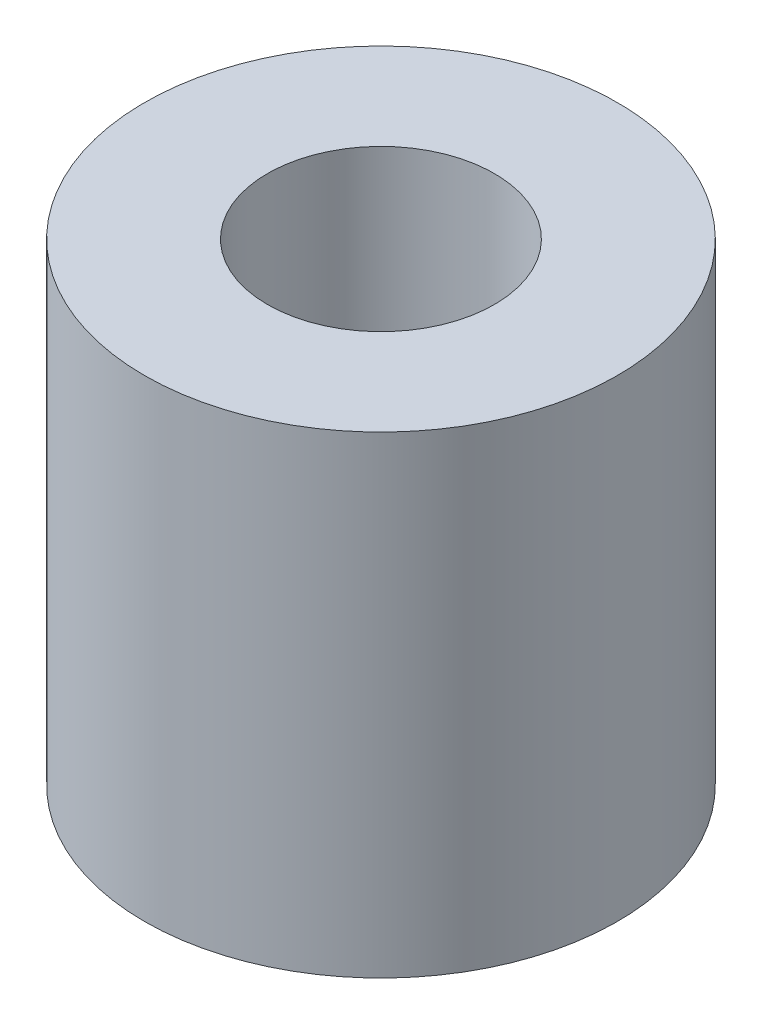
ISO-10303-21;
HEADER;
FILE_DESCRIPTION(('STEP AP214'),'2;1');
FILE_NAME('part.step','',(''),(''),'','','');
FILE_SCHEMA(('AUTOMOTIVE_DESIGN { 1 0 10303 214 1 1 1 1 }'));
ENDSEC;
DATA;
#1=APPLICATION_CONTEXT('core data for automotive mechanical design processes');
#2=APPLICATION_PROTOCOL_DEFINITION('international standard','automotive_design',2000,#1);
#3=PRODUCT_CONTEXT('',#1,'mechanical');
#4=PRODUCT('Part','Part','',(#3));
#5=PRODUCT_RELATED_PRODUCT_CATEGORY('part','',(#4));
#6=PRODUCT_DEFINITION_FORMATION('','',#4);
#7=PRODUCT_DEFINITION_CONTEXT('part definition',#1,'design');
#8=PRODUCT_DEFINITION('design','',#6,#7);
#9=PRODUCT_DEFINITION_SHAPE('','',#8);
#10=(LENGTH_UNIT() NAMED_UNIT(*) SI_UNIT(.MILLI.,.METRE.));
#11=(NAMED_UNIT(*) PLANE_ANGLE_UNIT() SI_UNIT($,.RADIAN.));
#12=(NAMED_UNIT(*) SI_UNIT($,.STERADIAN.) SOLID_ANGLE_UNIT());
#13=UNCERTAINTY_MEASURE_WITH_UNIT(LENGTH_MEASURE(1.E-05),#10,'distance_accuracy_value','');
#14=(GEOMETRIC_REPRESENTATION_CONTEXT(3) GLOBAL_UNCERTAINTY_ASSIGNED_CONTEXT((#13)) GLOBAL_UNIT_ASSIGNED_CONTEXT((#10,
#11,#12)) REPRESENTATION_CONTEXT('',''));
#15=CARTESIAN_POINT('',(0.,0.,0.));
#16=DIRECTION('',(0.,0.,1.));
#17=DIRECTION('',(1.,0.,0.));
#18=AXIS2_PLACEMENT_3D('',#15,#16,#17);
#19=CARTESIAN_POINT('',(0.,6.35,0.));
#20=DIRECTION('',(0.,1.,0.));
#21=DIRECTION('',(0.,0.,1.));
#22=AXIS2_PLACEMENT_3D('',#19,#20,#21);
#23=PLANE('',#22);
#24=CARTESIAN_POINT('',(0.,6.35,0.));
#25=DIRECTION('',(0.,1.,0.));
#26=DIRECTION('',(0.,0.,1.));
#27=AXIS2_PLACEMENT_3D('',#24,#25,#26);
#28=CIRCLE('',#27,3.175);
#29=CARTESIAN_POINT('',(0.,6.35,3.175));
#30=VERTEX_POINT('',#29);
#31=EDGE_CURVE('E10',#30,#30,#28,.T.);
#32=ORIENTED_EDGE('',*,*,#31,.T.);
#33=EDGE_LOOP('',(#32));
#34=FACE_BOUND('',#33,.T.);
#35=CARTESIAN_POINT('',(0.,6.35,0.));
#36=DIRECTION('',(0.,1.,0.));
#37=DIRECTION('',(0.,0.,1.));
#38=AXIS2_PLACEMENT_3D('',#35,#36,#37);
#39=CIRCLE('',#38,1.524);
#40=CARTESIAN_POINT('',(0.,6.35,1.524));
#41=VERTEX_POINT('',#40);
#42=EDGE_CURVE('E58',#41,#41,#39,.T.);
#43=ORIENTED_EDGE('',*,*,#42,.F.);
#44=EDGE_LOOP('',(#43));
#45=FACE_BOUND('',#44,.T.);
#46=ADVANCED_FACE('F45',(#34,#45),#23,.T.);
#47=CARTESIAN_POINT('',(0.,0.,0.));
#48=DIRECTION('',(0.,1.,0.));
#49=DIRECTION('',(0.,0.,1.));
#50=AXIS2_PLACEMENT_3D('',#47,#48,#49);
#51=PLANE('',#50);
#52=CARTESIAN_POINT('',(0.,0.,0.));
#53=DIRECTION('',(0.,1.,0.));
#54=DIRECTION('',(0.,0.,1.));
#55=AXIS2_PLACEMENT_3D('',#52,#53,#54);
#56=CIRCLE('',#55,3.175);
#57=CARTESIAN_POINT('',(0.,0.,3.175));
#58=VERTEX_POINT('',#57);
#59=EDGE_CURVE('E49',#58,#58,#56,.T.);
#60=ORIENTED_EDGE('',*,*,#59,.F.);
#61=EDGE_LOOP('',(#60));
#62=FACE_BOUND('',#61,.T.);
#63=CARTESIAN_POINT('',(0.,0.,0.));
#64=DIRECTION('',(0.,1.,0.));
#65=DIRECTION('',(0.,0.,1.));
#66=AXIS2_PLACEMENT_3D('',#63,#64,#65);
#67=CIRCLE('',#66,1.524);
#68=CARTESIAN_POINT('',(0.,0.,1.524));
#69=VERTEX_POINT('',#68);
#70=EDGE_CURVE('E60',#69,#69,#67,.T.);
#71=ORIENTED_EDGE('',*,*,#70,.T.);
#72=EDGE_LOOP('',(#71));
#73=FACE_BOUND('',#72,.T.);
#74=ADVANCED_FACE('F72',(#62,#73),#51,.F.);
#75=CARTESIAN_POINT('',(0.,6.35,0.));
#76=DIRECTION('',(0.,-1.,0.));
#77=DIRECTION('',(0.,0.,-1.));
#78=AXIS2_PLACEMENT_3D('',#75,#76,#77);
#79=CYLINDRICAL_SURFACE('',#78,3.175);
#80=ORIENTED_EDGE('',*,*,#31,.F.);
#81=EDGE_LOOP('',(#80));
#82=FACE_BOUND('',#81,.T.);
#83=ORIENTED_EDGE('',*,*,#59,.T.);
#84=EDGE_LOOP('',(#83));
#85=FACE_BOUND('',#84,.T.);
#86=ADVANCED_FACE('F47',(#82,#85),#79,.T.);
#87=CARTESIAN_POINT('',(0.,6.35,0.));
#88=DIRECTION('',(0.,-1.,0.));
#89=DIRECTION('',(0.,0.,-1.));
#90=AXIS2_PLACEMENT_3D('',#87,#88,#89);
#91=CYLINDRICAL_SURFACE('',#90,1.524);
#92=ORIENTED_EDGE('',*,*,#42,.T.);
#93=EDGE_LOOP('',(#92));
#94=FACE_BOUND('',#93,.T.);
#95=ORIENTED_EDGE('',*,*,#70,.F.);
#96=EDGE_LOOP('',(#95));
#97=FACE_BOUND('',#96,.T.);
#98=ADVANCED_FACE('F68',(#94,#97),#91,.F.);
#99=CLOSED_SHELL('',(#46,#74,#86,#98));
#100=MANIFOLD_SOLID_BREP('B2',#99);
#101=ADVANCED_BREP_SHAPE_REPRESENTATION('',(#18,#100),#14);
#102=SHAPE_DEFINITION_REPRESENTATION(#9,#101);
ENDSEC;
END-ISO-10303-21;
